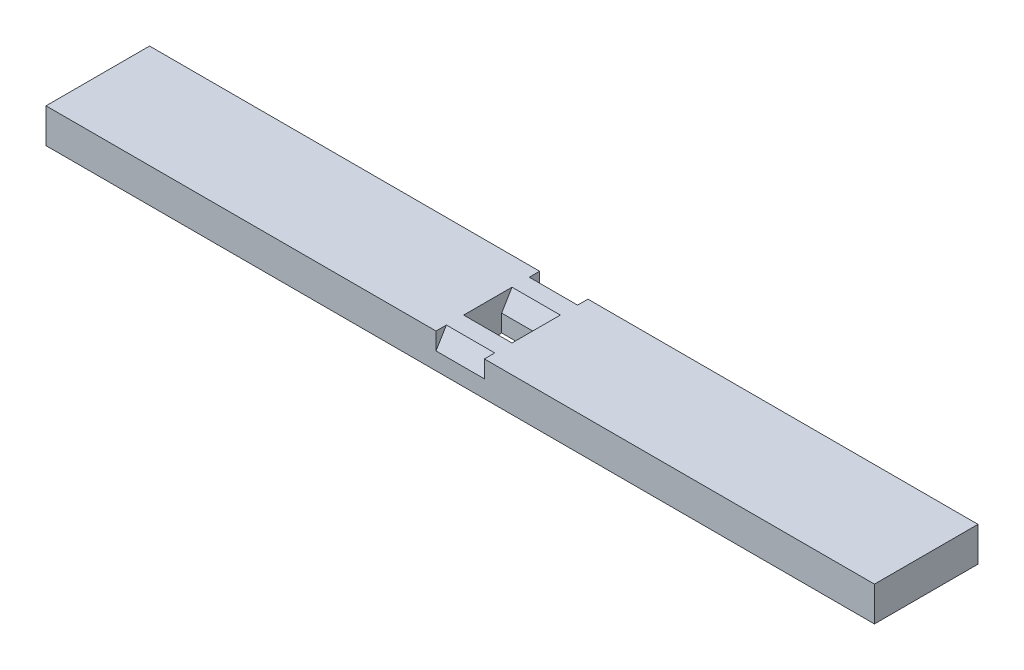
ISO-10303-21;
HEADER;
FILE_DESCRIPTION(('STEP AP214'),'2;1');
FILE_NAME('part.step','',(''),(''),'','','');
FILE_SCHEMA(('AUTOMOTIVE_DESIGN { 1 0 10303 214 1 1 1 1 }'));
ENDSEC;
DATA;
#1=APPLICATION_CONTEXT('core data for automotive mechanical design processes');
#2=APPLICATION_PROTOCOL_DEFINITION('international standard','automotive_design',2000,#1);
#3=PRODUCT_CONTEXT('',#1,'mechanical');
#4=PRODUCT('Part','Part','',(#3));
#5=PRODUCT_RELATED_PRODUCT_CATEGORY('part','',(#4));
#6=PRODUCT_DEFINITION_FORMATION('','',#4);
#7=PRODUCT_DEFINITION_CONTEXT('part definition',#1,'design');
#8=PRODUCT_DEFINITION('design','',#6,#7);
#9=PRODUCT_DEFINITION_SHAPE('','',#8);
#10=(LENGTH_UNIT() NAMED_UNIT(*) SI_UNIT(.MILLI.,.METRE.));
#11=(NAMED_UNIT(*) PLANE_ANGLE_UNIT() SI_UNIT($,.RADIAN.));
#12=(NAMED_UNIT(*) SI_UNIT($,.STERADIAN.) SOLID_ANGLE_UNIT());
#13=UNCERTAINTY_MEASURE_WITH_UNIT(LENGTH_MEASURE(1.E-05),#10,'distance_accuracy_value','');
#14=(GEOMETRIC_REPRESENTATION_CONTEXT(3) GLOBAL_UNCERTAINTY_ASSIGNED_CONTEXT((#13)) GLOBAL_UNIT_ASSIGNED_CONTEXT((#10,
#11,#12)) REPRESENTATION_CONTEXT('',''));
#15=CARTESIAN_POINT('',(0.,0.,0.));
#16=DIRECTION('',(0.,0.,1.));
#17=DIRECTION('',(1.,0.,0.));
#18=AXIS2_PLACEMENT_3D('',#15,#16,#17);
#19=CARTESIAN_POINT('',(0.,5.,0.));
#20=DIRECTION('',(0.,0.,-1.));
#21=DIRECTION('',(-1.,0.,0.));
#22=AXIS2_PLACEMENT_3D('',#19,#20,#21);
#23=PLANE('',#22);
#24=DIRECTION('',(0.,-1.,0.));
#25=VECTOR('',#24,1.);
#26=CARTESIAN_POINT('',(56.5,2.5,0.));
#27=LINE('',#26,#25);
#28=CARTESIAN_POINT('',(56.5,5.,0.));
#29=VERTEX_POINT('',#28);
#30=CARTESIAN_POINT('',(56.5,2.5,0.));
#31=VERTEX_POINT('',#30);
#32=EDGE_CURVE('E193',#29,#31,#27,.T.);
#33=ORIENTED_EDGE('',*,*,#32,.F.);
#34=DIRECTION('',(1.,0.,0.));
#35=VECTOR('',#34,1.);
#36=CARTESIAN_POINT('',(0.,5.,0.));
#37=LINE('',#36,#35);
#38=CARTESIAN_POINT('',(0.,5.,0.));
#39=VERTEX_POINT('',#38);
#40=EDGE_CURVE('E274',#39,#29,#37,.T.);
#41=ORIENTED_EDGE('',*,*,#40,.F.);
#42=DIRECTION('',(0.,-1.,0.));
#43=VECTOR('',#42,1.);
#44=CARTESIAN_POINT('',(0.,5.,0.));
#45=LINE('',#44,#43);
#46=CARTESIAN_POINT('',(0.,0.,0.));
#47=VERTEX_POINT('',#46);
#48=EDGE_CURVE('E309',#39,#47,#45,.T.);
#49=ORIENTED_EDGE('',*,*,#48,.T.);
#50=DIRECTION('',(1.,0.,0.));
#51=VECTOR('',#50,1.);
#52=CARTESIAN_POINT('',(0.,0.,0.));
#53=LINE('',#52,#51);
#54=CARTESIAN_POINT('',(120.,0.,0.));
#55=VERTEX_POINT('',#54);
#56=EDGE_CURVE('E290',#47,#55,#53,.T.);
#57=ORIENTED_EDGE('',*,*,#56,.T.);
#58=DIRECTION('',(0.,-1.,0.));
#59=VECTOR('',#58,1.);
#60=CARTESIAN_POINT('',(120.,5.,0.));
#61=LINE('',#60,#59);
#62=CARTESIAN_POINT('',(120.,5.,0.));
#63=VERTEX_POINT('',#62);
#64=EDGE_CURVE('E305',#63,#55,#61,.T.);
#65=ORIENTED_EDGE('',*,*,#64,.F.);
#66=CARTESIAN_POINT('',(63.5,5.,0.));
#67=VERTEX_POINT('',#66);
#68=EDGE_CURVE('E272',#67,#63,#37,.T.);
#69=ORIENTED_EDGE('',*,*,#68,.F.);
#70=DIRECTION('',(0.,-1.,0.));
#71=VECTOR('',#70,1.);
#72=CARTESIAN_POINT('',(63.5,2.5,0.));
#73=LINE('',#72,#71);
#74=CARTESIAN_POINT('',(63.5,2.5,0.));
#75=VERTEX_POINT('',#74);
#76=EDGE_CURVE('E62',#67,#75,#73,.T.);
#77=ORIENTED_EDGE('',*,*,#76,.T.);
#78=DIRECTION('',(-1.,0.,0.));
#79=VECTOR('',#78,1.);
#80=CARTESIAN_POINT('',(66.4165784029143,2.5,0.));
#81=LINE('',#80,#79);
#82=EDGE_CURVE('E192',#75,#31,#81,.T.);
#83=ORIENTED_EDGE('',*,*,#82,.T.);
#84=EDGE_LOOP('',(#33,#41,#49,#57,#65,#69,#77,#83));
#85=FACE_BOUND('',#84,.T.);
#86=ADVANCED_FACE('F38',(#85),#23,.F.);
#87=CARTESIAN_POINT('',(0.,5.,0.));
#88=DIRECTION('',(0.,-1.,0.));
#89=DIRECTION('',(0.,0.,-1.));
#90=AXIS2_PLACEMENT_3D('',#87,#88,#89);
#91=PLANE('',#90);
#92=DIRECTION('',(0.,0.,1.));
#93=VECTOR('',#92,1.);
#94=CARTESIAN_POINT('',(56.5,5.,-5.50000000000002));
#95=LINE('',#94,#93);
#96=CARTESIAN_POINT('',(56.5,5.,-11.));
#97=VERTEX_POINT('',#96);
#98=CARTESIAN_POINT('',(56.5,5.,-3.99785833546034));
#99=VERTEX_POINT('',#98);
#100=EDGE_CURVE('E166',#97,#99,#95,.T.);
#101=ORIENTED_EDGE('',*,*,#100,.F.);
#102=DIRECTION('',(-1.,0.,0.));
#103=VECTOR('',#102,1.);
#104=CARTESIAN_POINT('',(66.4165784029143,5.,-11.));
#105=LINE('',#104,#103);
#106=CARTESIAN_POINT('',(63.5,5.,-11.));
#107=VERTEX_POINT('',#106);
#108=EDGE_CURVE('E171',#107,#97,#105,.T.);
#109=ORIENTED_EDGE('',*,*,#108,.F.);
#110=DIRECTION('',(0.,0.,-1.));
#111=VECTOR('',#110,1.);
#112=CARTESIAN_POINT('',(63.5,5.,-5.50000000000002));
#113=LINE('',#112,#111);
#114=CARTESIAN_POINT('',(63.5,5.,-3.99785833546034));
#115=VERTEX_POINT('',#114);
#116=EDGE_CURVE('E153',#115,#107,#113,.T.);
#117=ORIENTED_EDGE('',*,*,#116,.F.);
#118=DIRECTION('',(-1.,0.,0.));
#119=VECTOR('',#118,1.);
#120=CARTESIAN_POINT('',(66.4165784029143,5.,-3.99785833546034));
#121=LINE('',#120,#119);
#122=EDGE_CURVE('E243',#115,#99,#121,.T.);
#123=ORIENTED_EDGE('',*,*,#122,.T.);
#124=EDGE_LOOP('',(#101,#109,#117,#123));
#125=FACE_BOUND('',#124,.T.);
#126=DIRECTION('',(-1.,0.,0.));
#127=VECTOR('',#126,1.);
#128=CARTESIAN_POINT('',(66.4165784029143,5.,-13.5));
#129=LINE('',#128,#127);
#130=CARTESIAN_POINT('',(63.5,5.,-13.5));
#131=VERTEX_POINT('',#130);
#132=CARTESIAN_POINT('',(56.5,5.,-13.5));
#133=VERTEX_POINT('',#132);
#134=EDGE_CURVE('E54',#131,#133,#129,.T.);
#135=ORIENTED_EDGE('',*,*,#134,.T.);
#136=DIRECTION('',(0.,0.,1.));
#137=VECTOR('',#136,1.);
#138=CARTESIAN_POINT('',(56.5,5.,-15.));
#139=LINE('',#138,#137);
#140=CARTESIAN_POINT('',(56.5,5.,-15.));
#141=VERTEX_POINT('',#140);
#142=EDGE_CURVE('E223',#141,#133,#139,.T.);
#143=ORIENTED_EDGE('',*,*,#142,.F.);
#144=DIRECTION('',(-1.,0.,0.));
#145=VECTOR('',#144,1.);
#146=CARTESIAN_POINT('',(0.,5.,-15.));
#147=LINE('',#146,#145);
#148=CARTESIAN_POINT('',(0.,5.,-15.));
#149=VERTEX_POINT('',#148);
#150=EDGE_CURVE('E281',#141,#149,#147,.T.);
#151=ORIENTED_EDGE('',*,*,#150,.T.);
#152=DIRECTION('',(0.,0.,1.));
#153=VECTOR('',#152,1.);
#154=CARTESIAN_POINT('',(0.,5.,0.));
#155=LINE('',#154,#153);
#156=EDGE_CURVE('E268',#149,#39,#155,.T.);
#157=ORIENTED_EDGE('',*,*,#156,.T.);
#158=ORIENTED_EDGE('',*,*,#40,.T.);
#159=DIRECTION('',(0.,0.,1.));
#160=VECTOR('',#159,1.);
#161=CARTESIAN_POINT('',(56.5,5.,0.));
#162=LINE('',#161,#160);
#163=CARTESIAN_POINT('',(56.5,5.,-1.5));
#164=VERTEX_POINT('',#163);
#165=EDGE_CURVE('E196',#164,#29,#162,.T.);
#166=ORIENTED_EDGE('',*,*,#165,.F.);
#167=DIRECTION('',(-1.,0.,0.));
#168=VECTOR('',#167,1.);
#169=CARTESIAN_POINT('',(66.4165784029143,5.,-1.5));
#170=LINE('',#169,#168);
#171=CARTESIAN_POINT('',(63.5,5.,-1.5));
#172=VERTEX_POINT('',#171);
#173=EDGE_CURVE('E199',#172,#164,#170,.T.);
#174=ORIENTED_EDGE('',*,*,#173,.F.);
#175=DIRECTION('',(0.,0.,1.));
#176=VECTOR('',#175,1.);
#177=CARTESIAN_POINT('',(63.5,5.,0.));
#178=LINE('',#177,#176);
#179=EDGE_CURVE('E202',#172,#67,#178,.T.);
#180=ORIENTED_EDGE('',*,*,#179,.T.);
#181=ORIENTED_EDGE('',*,*,#68,.T.);
#182=DIRECTION('',(0.,0.,-1.));
#183=VECTOR('',#182,1.);
#184=CARTESIAN_POINT('',(120.,5.,0.));
#185=LINE('',#184,#183);
#186=CARTESIAN_POINT('',(120.,5.,-15.));
#187=VERTEX_POINT('',#186);
#188=EDGE_CURVE('E278',#63,#187,#185,.T.);
#189=ORIENTED_EDGE('',*,*,#188,.T.);
#190=CARTESIAN_POINT('',(63.5,5.,-15.));
#191=VERTEX_POINT('',#190);
#192=EDGE_CURVE('E282',#187,#191,#147,.T.);
#193=ORIENTED_EDGE('',*,*,#192,.T.);
#194=DIRECTION('',(0.,0.,1.));
#195=VECTOR('',#194,1.);
#196=CARTESIAN_POINT('',(63.5,5.,-15.));
#197=LINE('',#196,#195);
#198=EDGE_CURVE('E229',#191,#131,#197,.T.);
#199=ORIENTED_EDGE('',*,*,#198,.T.);
#200=EDGE_LOOP('',(#135,#143,#151,#157,#158,#166,#174,#180,#181,#189,#193,#199));
#201=FACE_BOUND('',#200,.T.);
#202=ADVANCED_FACE('F178',(#125,#201),#91,.F.);
#203=CARTESIAN_POINT('',(56.5,-5.,-5.50000000000002));
#204=DIRECTION('',(0.,0.,1.));
#205=DIRECTION('',(1.,0.,0.));
#206=AXIS2_PLACEMENT_3D('',#203,#204,#205);
#207=PLANE('',#206);
#208=DIRECTION('',(-1.,0.,0.));
#209=VECTOR('',#208,1.);
#210=CARTESIAN_POINT('',(66.4165784029143,2.5,-5.50000000000002));
#211=LINE('',#210,#209);
#212=CARTESIAN_POINT('',(63.5,2.5,-5.50000000000002));
#213=VERTEX_POINT('',#212);
#214=CARTESIAN_POINT('',(56.5,2.5,-5.50000000000002));
#215=VERTEX_POINT('',#214);
#216=EDGE_CURVE('E176',#213,#215,#211,.T.);
#217=ORIENTED_EDGE('',*,*,#216,.F.);
#218=DIRECTION('',(0.,1.,0.));
#219=VECTOR('',#218,1.);
#220=CARTESIAN_POINT('',(63.5,-5.,-5.50000000000002));
#221=LINE('',#220,#219);
#222=CARTESIAN_POINT('',(63.5,0.,-5.50000000000002));
#223=VERTEX_POINT('',#222);
#224=EDGE_CURVE('E254',#223,#213,#221,.T.);
#225=ORIENTED_EDGE('',*,*,#224,.F.);
#226=DIRECTION('',(-1.,0.,0.));
#227=VECTOR('',#226,1.);
#228=CARTESIAN_POINT('',(0.,0.,-5.50000000000002));
#229=LINE('',#228,#227);
#230=CARTESIAN_POINT('',(56.5,0.,-5.50000000000002));
#231=VERTEX_POINT('',#230);
#232=EDGE_CURVE('E47',#223,#231,#229,.T.);
#233=ORIENTED_EDGE('',*,*,#232,.T.);
#234=DIRECTION('',(0.,1.,0.));
#235=VECTOR('',#234,1.);
#236=CARTESIAN_POINT('',(56.5,-5.,-5.50000000000002));
#237=LINE('',#236,#235);
#238=EDGE_CURVE('E258',#231,#215,#237,.T.);
#239=ORIENTED_EDGE('',*,*,#238,.T.);
#240=EDGE_LOOP('',(#217,#225,#233,#239));
#241=FACE_BOUND('',#240,.T.);
#242=ADVANCED_FACE('F325',(#241),#207,.F.);
#243=CARTESIAN_POINT('',(56.5,-5.,-9.50000000000002));
#244=DIRECTION('',(0.,0.,-1.));
#245=DIRECTION('',(-1.,0.,0.));
#246=AXIS2_PLACEMENT_3D('',#243,#244,#245);
#247=PLANE('',#246);
#248=DIRECTION('',(-1.,0.,0.));
#249=VECTOR('',#248,1.);
#250=CARTESIAN_POINT('',(66.4165784029143,2.5,-9.50000000000002));
#251=LINE('',#250,#249);
#252=CARTESIAN_POINT('',(63.5,2.5,-9.50000000000002));
#253=VERTEX_POINT('',#252);
#254=CARTESIAN_POINT('',(56.5,2.5,-9.50000000000002));
#255=VERTEX_POINT('',#254);
#256=EDGE_CURVE('E174',#253,#255,#251,.T.);
#257=ORIENTED_EDGE('',*,*,#256,.T.);
#258=DIRECTION('',(0.,1.,0.));
#259=VECTOR('',#258,1.);
#260=CARTESIAN_POINT('',(56.5,-5.,-9.50000000000002));
#261=LINE('',#260,#259);
#262=CARTESIAN_POINT('',(56.5,0.,-9.50000000000002));
#263=VERTEX_POINT('',#262);
#264=EDGE_CURVE('E262',#263,#255,#261,.T.);
#265=ORIENTED_EDGE('',*,*,#264,.F.);
#266=DIRECTION('',(1.,0.,0.));
#267=VECTOR('',#266,1.);
#268=CARTESIAN_POINT('',(0.,0.,-9.50000000000002));
#269=LINE('',#268,#267);
#270=CARTESIAN_POINT('',(63.5,0.,-9.50000000000002));
#271=VERTEX_POINT('',#270);
#272=EDGE_CURVE('E313',#263,#271,#269,.T.);
#273=ORIENTED_EDGE('',*,*,#272,.T.);
#274=DIRECTION('',(0.,1.,0.));
#275=VECTOR('',#274,1.);
#276=CARTESIAN_POINT('',(63.5,-5.,-9.50000000000002));
#277=LINE('',#276,#275);
#278=EDGE_CURVE('E253',#271,#253,#277,.T.);
#279=ORIENTED_EDGE('',*,*,#278,.T.);
#280=EDGE_LOOP('',(#257,#265,#273,#279));
#281=FACE_BOUND('',#280,.T.);
#282=ADVANCED_FACE('F336',(#281),#247,.F.);
#283=CARTESIAN_POINT('',(0.,5.,0.));
#284=DIRECTION('',(1.,0.,0.));
#285=DIRECTION('',(0.,0.,-1.));
#286=AXIS2_PLACEMENT_3D('',#283,#284,#285);
#287=PLANE('',#286);
#288=DIRECTION('',(0.,0.,1.));
#289=VECTOR('',#288,1.);
#290=CARTESIAN_POINT('',(0.,0.,0.));
#291=LINE('',#290,#289);
#292=CARTESIAN_POINT('',(0.,0.,-15.));
#293=VERTEX_POINT('',#292);
#294=EDGE_CURVE('E257',#293,#47,#291,.T.);
#295=ORIENTED_EDGE('',*,*,#294,.T.);
#296=ORIENTED_EDGE('',*,*,#48,.F.);
#297=ORIENTED_EDGE('',*,*,#156,.F.);
#298=DIRECTION('',(0.,-1.,0.));
#299=VECTOR('',#298,1.);
#300=CARTESIAN_POINT('',(0.,5.,-15.));
#301=LINE('',#300,#299);
#302=EDGE_CURVE('E286',#149,#293,#301,.T.);
#303=ORIENTED_EDGE('',*,*,#302,.T.);
#304=EDGE_LOOP('',(#295,#296,#297,#303));
#305=FACE_BOUND('',#304,.T.);
#306=ADVANCED_FACE('F40',(#305),#287,.F.);
#307=CARTESIAN_POINT('',(120.,5.,0.));
#308=DIRECTION('',(-1.,0.,0.));
#309=DIRECTION('',(0.,0.,1.));
#310=AXIS2_PLACEMENT_3D('',#307,#308,#309);
#311=PLANE('',#310);
#312=DIRECTION('',(0.,0.,-1.));
#313=VECTOR('',#312,1.);
#314=CARTESIAN_POINT('',(120.,0.,0.));
#315=LINE('',#314,#313);
#316=CARTESIAN_POINT('',(120.,0.,-15.));
#317=VERTEX_POINT('',#316);
#318=EDGE_CURVE('E293',#55,#317,#315,.T.);
#319=ORIENTED_EDGE('',*,*,#318,.T.);
#320=DIRECTION('',(0.,-1.,0.));
#321=VECTOR('',#320,1.);
#322=CARTESIAN_POINT('',(120.,5.,-15.));
#323=LINE('',#322,#321);
#324=EDGE_CURVE('E301',#187,#317,#323,.T.);
#325=ORIENTED_EDGE('',*,*,#324,.F.);
#326=ORIENTED_EDGE('',*,*,#188,.F.);
#327=ORIENTED_EDGE('',*,*,#64,.T.);
#328=EDGE_LOOP('',(#319,#325,#326,#327));
#329=FACE_BOUND('',#328,.T.);
#330=ADVANCED_FACE('F361',(#329),#311,.F.);
#331=CARTESIAN_POINT('',(0.,5.,-15.));
#332=DIRECTION('',(0.,0.,1.));
#333=DIRECTION('',(1.,0.,0.));
#334=AXIS2_PLACEMENT_3D('',#331,#332,#333);
#335=PLANE('',#334);
#336=ORIENTED_EDGE('',*,*,#150,.F.);
#337=DIRECTION('',(0.,1.,0.));
#338=VECTOR('',#337,1.);
#339=CARTESIAN_POINT('',(56.5,2.5,-15.));
#340=LINE('',#339,#338);
#341=CARTESIAN_POINT('',(56.5,2.5,-15.));
#342=VERTEX_POINT('',#341);
#343=EDGE_CURVE('E214',#342,#141,#340,.T.);
#344=ORIENTED_EDGE('',*,*,#343,.F.);
#345=DIRECTION('',(-1.,0.,0.));
#346=VECTOR('',#345,1.);
#347=CARTESIAN_POINT('',(66.4165784029143,2.5,-15.));
#348=LINE('',#347,#346);
#349=CARTESIAN_POINT('',(63.5,2.5,-15.));
#350=VERTEX_POINT('',#349);
#351=EDGE_CURVE('E218',#350,#342,#348,.T.);
#352=ORIENTED_EDGE('',*,*,#351,.F.);
#353=DIRECTION('',(0.,1.,0.));
#354=VECTOR('',#353,1.);
#355=CARTESIAN_POINT('',(63.5,2.5,-15.));
#356=LINE('',#355,#354);
#357=EDGE_CURVE('E217',#350,#191,#356,.T.);
#358=ORIENTED_EDGE('',*,*,#357,.T.);
#359=ORIENTED_EDGE('',*,*,#192,.F.);
#360=ORIENTED_EDGE('',*,*,#324,.T.);
#361=DIRECTION('',(-1.,0.,0.));
#362=VECTOR('',#361,1.);
#363=CARTESIAN_POINT('',(0.,0.,-15.));
#364=LINE('',#363,#362);
#365=EDGE_CURVE('E273',#317,#293,#364,.T.);
#366=ORIENTED_EDGE('',*,*,#365,.T.);
#367=ORIENTED_EDGE('',*,*,#302,.F.);
#368=EDGE_LOOP('',(#336,#344,#352,#358,#359,#360,#366,#367));
#369=FACE_BOUND('',#368,.T.);
#370=ADVANCED_FACE('F364',(#369),#335,.F.);
#371=CARTESIAN_POINT('',(0.,0.,0.));
#372=DIRECTION('',(0.,-1.,0.));
#373=DIRECTION('',(0.,0.,-1.));
#374=AXIS2_PLACEMENT_3D('',#371,#372,#373);
#375=PLANE('',#374);
#376=DIRECTION('',(0.,0.,1.));
#377=VECTOR('',#376,1.);
#378=CARTESIAN_POINT('',(63.5,0.,0.));
#379=LINE('',#378,#377);
#380=EDGE_CURVE('E11',#271,#223,#379,.T.);
#381=ORIENTED_EDGE('',*,*,#380,.F.);
#382=ORIENTED_EDGE('',*,*,#272,.F.);
#383=DIRECTION('',(0.,0.,-1.));
#384=VECTOR('',#383,1.);
#385=CARTESIAN_POINT('',(56.5,0.,0.));
#386=LINE('',#385,#384);
#387=EDGE_CURVE('E316',#231,#263,#386,.T.);
#388=ORIENTED_EDGE('',*,*,#387,.F.);
#389=ORIENTED_EDGE('',*,*,#232,.F.);
#390=EDGE_LOOP('',(#381,#382,#388,#389));
#391=FACE_BOUND('',#390,.T.);
#392=ORIENTED_EDGE('',*,*,#294,.F.);
#393=ORIENTED_EDGE('',*,*,#365,.F.);
#394=ORIENTED_EDGE('',*,*,#318,.F.);
#395=ORIENTED_EDGE('',*,*,#56,.F.);
#396=EDGE_LOOP('',(#392,#393,#394,#395));
#397=FACE_BOUND('',#396,.T.);
#398=ADVANCED_FACE('F333',(#391,#397),#375,.T.);
#399=CARTESIAN_POINT('',(63.5,-5.,-5.50000000000002));
#400=DIRECTION('',(1.,0.,0.));
#401=DIRECTION('',(0.,0.,-1.));
#402=AXIS2_PLACEMENT_3D('',#399,#400,#401);
#403=PLANE('',#402);
#404=ORIENTED_EDGE('',*,*,#380,.T.);
#405=ORIENTED_EDGE('',*,*,#224,.T.);
#406=DIRECTION('',(0.,-0.85716879666323,-0.515035585204471));
#407=VECTOR('',#406,1.);
#408=CARTESIAN_POINT('',(63.5,5.,-3.99785833546034));
#409=LINE('',#408,#407);
#410=EDGE_CURVE('E160',#115,#213,#409,.T.);
#411=ORIENTED_EDGE('',*,*,#410,.F.);
#412=ORIENTED_EDGE('',*,*,#116,.T.);
#413=DIRECTION('',(0.,0.857492925712544,-0.514495755427526));
#414=VECTOR('',#413,1.);
#415=CARTESIAN_POINT('',(63.5,5.,-11.));
#416=LINE('',#415,#414);
#417=EDGE_CURVE('E157',#253,#107,#416,.T.);
#418=ORIENTED_EDGE('',*,*,#417,.F.);
#419=ORIENTED_EDGE('',*,*,#278,.F.);
#420=EDGE_LOOP('',(#404,#405,#411,#412,#418,#419));
#421=FACE_BOUND('',#420,.T.);
#422=ADVANCED_FACE('F155',(#421),#403,.F.);
#423=CARTESIAN_POINT('',(56.5,-5.,-5.50000000000002));
#424=DIRECTION('',(-1.,0.,0.));
#425=DIRECTION('',(0.,0.,1.));
#426=AXIS2_PLACEMENT_3D('',#423,#424,#425);
#427=PLANE('',#426);
#428=ORIENTED_EDGE('',*,*,#387,.T.);
#429=ORIENTED_EDGE('',*,*,#264,.T.);
#430=DIRECTION('',(0.,0.857492925712544,-0.514495755427526));
#431=VECTOR('',#430,1.);
#432=CARTESIAN_POINT('',(56.5,5.,-11.));
#433=LINE('',#432,#431);
#434=EDGE_CURVE('E181',#255,#97,#433,.T.);
#435=ORIENTED_EDGE('',*,*,#434,.T.);
#436=ORIENTED_EDGE('',*,*,#100,.T.);
#437=DIRECTION('',(0.,-0.857168796663229,-0.51503558520447));
#438=VECTOR('',#437,1.);
#439=CARTESIAN_POINT('',(56.5,5.,-3.99785833546034));
#440=LINE('',#439,#438);
#441=EDGE_CURVE('E240',#99,#215,#440,.T.);
#442=ORIENTED_EDGE('',*,*,#441,.T.);
#443=ORIENTED_EDGE('',*,*,#238,.F.);
#444=EDGE_LOOP('',(#428,#429,#435,#436,#442,#443));
#445=FACE_BOUND('',#444,.T.);
#446=ADVANCED_FACE('F330',(#445),#427,.F.);
#447=CARTESIAN_POINT('',(66.4165784029143,5.,-11.));
#448=DIRECTION('',(0.,0.514495755427526,0.857492925712544));
#449=DIRECTION('',(0.,-0.857492925712544,0.514495755427526));
#450=AXIS2_PLACEMENT_3D('',#447,#448,#449);
#451=PLANE('',#450);
#452=ORIENTED_EDGE('',*,*,#417,.T.);
#453=ORIENTED_EDGE('',*,*,#108,.T.);
#454=ORIENTED_EDGE('',*,*,#434,.F.);
#455=ORIENTED_EDGE('',*,*,#256,.F.);
#456=EDGE_LOOP('',(#452,#453,#454,#455));
#457=FACE_BOUND('',#456,.T.);
#458=ADVANCED_FACE('F170',(#457),#451,.T.);
#459=CARTESIAN_POINT('',(66.4165784029143,5.,-3.99785833546034));
#460=DIRECTION('',(0.,0.51503558520447,-0.857168796663229));
#461=DIRECTION('',(0.,0.85716879666323,0.515035585204471));
#462=AXIS2_PLACEMENT_3D('',#459,#460,#461);
#463=PLANE('',#462);
#464=ORIENTED_EDGE('',*,*,#410,.T.);
#465=ORIENTED_EDGE('',*,*,#216,.T.);
#466=ORIENTED_EDGE('',*,*,#441,.F.);
#467=ORIENTED_EDGE('',*,*,#122,.F.);
#468=EDGE_LOOP('',(#464,#465,#466,#467));
#469=FACE_BOUND('',#468,.T.);
#470=ADVANCED_FACE('F338',(#469),#463,.T.);
#471=CARTESIAN_POINT('',(66.4165784029143,5.,-1.5));
#472=DIRECTION('',(0.,0.514495755427526,0.857492925712544));
#473=DIRECTION('',(0.,-0.857492925712544,0.514495755427527));
#474=AXIS2_PLACEMENT_3D('',#471,#472,#473);
#475=PLANE('',#474);
#476=DIRECTION('',(0.,0.857492925712544,-0.514495755427527));
#477=VECTOR('',#476,1.);
#478=CARTESIAN_POINT('',(63.5,5.,-1.5));
#479=LINE('',#478,#477);
#480=EDGE_CURVE('E191',#75,#172,#479,.T.);
#481=ORIENTED_EDGE('',*,*,#480,.T.);
#482=ORIENTED_EDGE('',*,*,#173,.T.);
#483=DIRECTION('',(0.,0.857492925712544,-0.514495755427526));
#484=VECTOR('',#483,1.);
#485=CARTESIAN_POINT('',(56.5,5.,-1.5));
#486=LINE('',#485,#484);
#487=EDGE_CURVE('E187',#31,#164,#486,.T.);
#488=ORIENTED_EDGE('',*,*,#487,.F.);
#489=ORIENTED_EDGE('',*,*,#82,.F.);
#490=EDGE_LOOP('',(#481,#482,#488,#489));
#491=FACE_BOUND('',#490,.T.);
#492=ADVANCED_FACE('F340',(#491),#475,.T.);
#493=CARTESIAN_POINT('',(56.5,0.,0.));
#494=DIRECTION('',(1.,0.,0.));
#495=DIRECTION('',(0.,0.,-1.));
#496=AXIS2_PLACEMENT_3D('',#493,#494,#495);
#497=PLANE('',#496);
#498=ORIENTED_EDGE('',*,*,#165,.T.);
#499=ORIENTED_EDGE('',*,*,#32,.T.);
#500=ORIENTED_EDGE('',*,*,#487,.T.);
#501=EDGE_LOOP('',(#498,#499,#500));
#502=FACE_BOUND('',#501,.T.);
#503=ADVANCED_FACE('F346',(#502),#497,.T.);
#504=CARTESIAN_POINT('',(63.5,-5.,-5.50000000000002));
#505=DIRECTION('',(1.,0.,0.));
#506=DIRECTION('',(0.,0.,-1.));
#507=AXIS2_PLACEMENT_3D('',#504,#505,#506);
#508=PLANE('',#507);
#509=ORIENTED_EDGE('',*,*,#480,.F.);
#510=ORIENTED_EDGE('',*,*,#76,.F.);
#511=ORIENTED_EDGE('',*,*,#179,.F.);
#512=EDGE_LOOP('',(#509,#510,#511));
#513=FACE_BOUND('',#512,.T.);
#514=ADVANCED_FACE('F416',(#513),#508,.F.);
#515=CARTESIAN_POINT('',(66.4165784029143,5.,-13.5));
#516=DIRECTION('',(0.,0.514495755427526,-0.857492925712544));
#517=DIRECTION('',(0.,0.857492925712544,0.514495755427526));
#518=AXIS2_PLACEMENT_3D('',#515,#516,#517);
#519=PLANE('',#518);
#520=DIRECTION('',(0.,-0.857492925712544,-0.514495755427526));
#521=VECTOR('',#520,1.);
#522=CARTESIAN_POINT('',(63.5,5.,-13.5));
#523=LINE('',#522,#521);
#524=EDGE_CURVE('E213',#131,#350,#523,.T.);
#525=ORIENTED_EDGE('',*,*,#524,.T.);
#526=ORIENTED_EDGE('',*,*,#351,.T.);
#527=DIRECTION('',(0.,-0.857492925712544,-0.514495755427526));
#528=VECTOR('',#527,1.);
#529=CARTESIAN_POINT('',(56.5,5.,-13.5));
#530=LINE('',#529,#528);
#531=EDGE_CURVE('E219',#133,#342,#530,.T.);
#532=ORIENTED_EDGE('',*,*,#531,.F.);
#533=ORIENTED_EDGE('',*,*,#134,.F.);
#534=EDGE_LOOP('',(#525,#526,#532,#533));
#535=FACE_BOUND('',#534,.T.);
#536=ADVANCED_FACE('F426',(#535),#519,.T.);
#537=CARTESIAN_POINT('',(56.5,0.,0.));
#538=DIRECTION('',(-1.,0.,0.));
#539=DIRECTION('',(0.,0.,1.));
#540=AXIS2_PLACEMENT_3D('',#537,#538,#539);
#541=PLANE('',#540);
#542=ORIENTED_EDGE('',*,*,#142,.T.);
#543=ORIENTED_EDGE('',*,*,#531,.T.);
#544=ORIENTED_EDGE('',*,*,#343,.T.);
#545=EDGE_LOOP('',(#542,#543,#544));
#546=FACE_BOUND('',#545,.T.);
#547=ADVANCED_FACE('F435',(#546),#541,.F.);
#548=CARTESIAN_POINT('',(63.5,-5.,-5.50000000000002));
#549=DIRECTION('',(1.,0.,0.));
#550=DIRECTION('',(0.,0.,-1.));
#551=AXIS2_PLACEMENT_3D('',#548,#549,#550);
#552=PLANE('',#551);
#553=ORIENTED_EDGE('',*,*,#357,.F.);
#554=ORIENTED_EDGE('',*,*,#524,.F.);
#555=ORIENTED_EDGE('',*,*,#198,.F.);
#556=EDGE_LOOP('',(#553,#554,#555));
#557=FACE_BOUND('',#556,.T.);
#558=ADVANCED_FACE('F444',(#557),#552,.F.);
#559=CLOSED_SHELL('',(#86,#202,#242,#282,#306,#330,#370,#398,#422,#446,#458,#470,#492,#503,#514,
#536,#547,#558));
#560=MANIFOLD_SOLID_BREP('B2',#559);
#561=ADVANCED_BREP_SHAPE_REPRESENTATION('',(#18,#560),#14);
#562=SHAPE_DEFINITION_REPRESENTATION(#9,#561);
ENDSEC;
END-ISO-10303-21;
